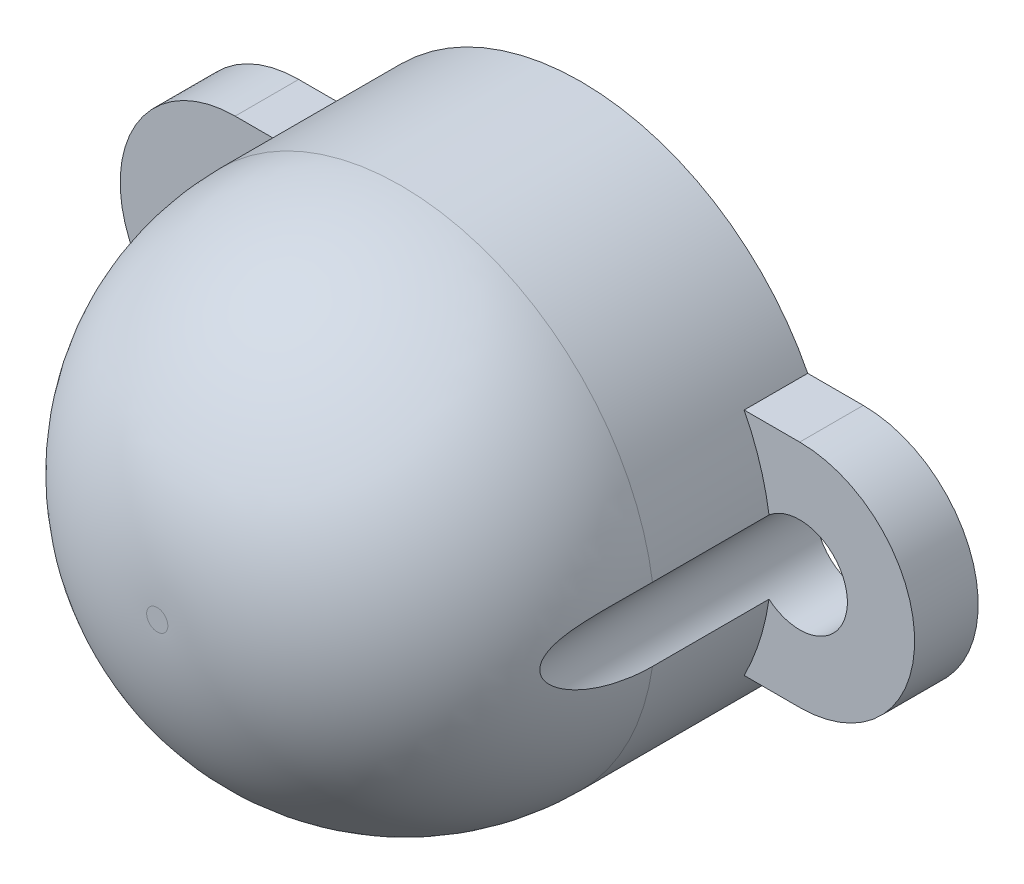
ISO-10303-21;
HEADER;
FILE_DESCRIPTION(('STEP AP214'),'2;1');
FILE_NAME('part.step','',(''),(''),'','','');
FILE_SCHEMA(('AUTOMOTIVE_DESIGN { 1 0 10303 214 1 1 1 1 }'));
ENDSEC;
DATA;
#1=APPLICATION_CONTEXT('core data for automotive mechanical design processes');
#2=APPLICATION_PROTOCOL_DEFINITION('international standard','automotive_design',2000,#1);
#3=PRODUCT_CONTEXT('',#1,'mechanical');
#4=PRODUCT('Part','Part','',(#3));
#5=PRODUCT_RELATED_PRODUCT_CATEGORY('part','',(#4));
#6=PRODUCT_DEFINITION_FORMATION('','',#4);
#7=PRODUCT_DEFINITION_CONTEXT('part definition',#1,'design');
#8=PRODUCT_DEFINITION('design','',#6,#7);
#9=PRODUCT_DEFINITION_SHAPE('','',#8);
#10=(LENGTH_UNIT() NAMED_UNIT(*) SI_UNIT(.MILLI.,.METRE.));
#11=(NAMED_UNIT(*) PLANE_ANGLE_UNIT() SI_UNIT($,.RADIAN.));
#12=(NAMED_UNIT(*) SI_UNIT($,.STERADIAN.) SOLID_ANGLE_UNIT());
#13=UNCERTAINTY_MEASURE_WITH_UNIT(LENGTH_MEASURE(1.E-05),#10,'distance_accuracy_value','');
#14=(GEOMETRIC_REPRESENTATION_CONTEXT(3) GLOBAL_UNCERTAINTY_ASSIGNED_CONTEXT((#13)) GLOBAL_UNIT_ASSIGNED_CONTEXT((#10,
#11,#12)) REPRESENTATION_CONTEXT('',''));
#15=CARTESIAN_POINT('',(0.,0.,0.));
#16=DIRECTION('',(0.,0.,1.));
#17=DIRECTION('',(1.,0.,0.));
#18=AXIS2_PLACEMENT_3D('',#15,#16,#17);
#19=CARTESIAN_POINT('',(0.,0.,0.));
#20=DIRECTION('',(0.,0.,-1.));
#21=DIRECTION('',(-1.,0.,0.));
#22=AXIS2_PLACEMENT_3D('',#19,#20,#21);
#23=CYLINDRICAL_SURFACE('',#22,6.096);
#24=DIRECTION('',(0.,0.,-1.));
#25=VECTOR('',#24,1.);
#26=CARTESIAN_POINT('',(6.03296463414635,-0.874387627508251,14.3509999999997));
#27=LINE('',#26,#25);
#28=CARTESIAN_POINT('',(6.03296463414634,-0.874387627508249,4.318));
#29=VERTEX_POINT('',#28);
#30=CARTESIAN_POINT('',(6.03296463414634,-0.874387627508254,1.524));
#31=VERTEX_POINT('',#30);
#32=EDGE_CURVE('E53',#29,#31,#27,.T.);
#33=ORIENTED_EDGE('',*,*,#32,.F.);
#34=CARTESIAN_POINT('',(0.,0.,4.318));
#35=DIRECTION('',(0.,0.,-1.));
#36=DIRECTION('',(-1.,0.,0.));
#37=AXIS2_PLACEMENT_3D('',#34,#35,#36);
#38=CIRCLE('',#37,6.096);
#39=CARTESIAN_POINT('',(-6.03296463414634,-0.87438762750825,4.318));
#40=VERTEX_POINT('',#39);
#41=EDGE_CURVE('E60',#29,#40,#38,.T.);
#42=ORIENTED_EDGE('',*,*,#41,.T.);
#43=DIRECTION('',(0.,0.,-1.));
#44=VECTOR('',#43,1.);
#45=CARTESIAN_POINT('',(-6.03296463414634,-0.874387627508248,14.3509999999997));
#46=LINE('',#45,#44);
#47=CARTESIAN_POINT('',(-6.03296463414634,-0.874387627508248,1.524));
#48=VERTEX_POINT('',#47);
#49=EDGE_CURVE('E272',#48,#40,#46,.F.);
#50=ORIENTED_EDGE('',*,*,#49,.F.);
#51=CARTESIAN_POINT('',(0.,0.,1.524));
#52=DIRECTION('',(0.,0.,1.));
#53=DIRECTION('',(1.,0.,0.));
#54=AXIS2_PLACEMENT_3D('',#51,#52,#53);
#55=CIRCLE('',#54,6.096);
#56=CARTESIAN_POINT('',(-5.43748390250491,-2.7559,1.524));
#57=VERTEX_POINT('',#56);
#58=EDGE_CURVE('E150',#57,#48,#55,.F.);
#59=ORIENTED_EDGE('',*,*,#58,.F.);
#60=DIRECTION('',(0.,0.,-1.));
#61=VECTOR('',#60,1.);
#62=CARTESIAN_POINT('',(-5.43748390250491,-2.7559,0.));
#63=LINE('',#62,#61);
#64=CARTESIAN_POINT('',(-5.43748390250491,-2.7559,0.));
#65=VERTEX_POINT('',#64);
#66=EDGE_CURVE('E158',#57,#65,#63,.T.);
#67=ORIENTED_EDGE('',*,*,#66,.T.);
#68=CARTESIAN_POINT('',(0.,0.,0.));
#69=DIRECTION('',(0.,0.,-1.));
#70=DIRECTION('',(-1.,0.,0.));
#71=AXIS2_PLACEMENT_3D('',#68,#69,#70);
#72=CIRCLE('',#71,6.096);
#73=CARTESIAN_POINT('',(5.43748390250491,-2.7559,0.));
#74=VERTEX_POINT('',#73);
#75=EDGE_CURVE('E216',#74,#65,#72,.T.);
#76=ORIENTED_EDGE('',*,*,#75,.F.);
#77=DIRECTION('',(0.,0.,-1.));
#78=VECTOR('',#77,1.);
#79=CARTESIAN_POINT('',(5.43748390250491,-2.7559,0.));
#80=LINE('',#79,#78);
#81=CARTESIAN_POINT('',(5.43748390250491,-2.7559,1.524));
#82=VERTEX_POINT('',#81);
#83=EDGE_CURVE('E147',#74,#82,#80,.F.);
#84=ORIENTED_EDGE('',*,*,#83,.T.);
#85=EDGE_CURVE('E148',#31,#82,#55,.F.);
#86=ORIENTED_EDGE('',*,*,#85,.F.);
#87=EDGE_LOOP('',(#33,#42,#50,#59,#67,#76,#84,#86));
#88=FACE_BOUND('',#87,.T.);
#89=ADVANCED_FACE('F33',(#88),#23,.T.);
#90=DIRECTION('',(0.,0.,-1.));
#91=VECTOR('',#90,1.);
#92=CARTESIAN_POINT('',(6.03296463414635,0.874387627508251,14.3509999999997));
#93=LINE('',#92,#91);
#94=CARTESIAN_POINT('',(6.03296463414634,0.874387627508254,1.524));
#95=VERTEX_POINT('',#94);
#96=CARTESIAN_POINT('',(6.03296463414634,0.874387627508251,4.318));
#97=VERTEX_POINT('',#96);
#98=EDGE_CURVE('E127',#95,#97,#93,.F.);
#99=ORIENTED_EDGE('',*,*,#98,.F.);
#100=CARTESIAN_POINT('',(5.43748390250491,2.75590000000001,1.524));
#101=VERTEX_POINT('',#100);
#102=EDGE_CURVE('E137',#101,#95,#55,.F.);
#103=ORIENTED_EDGE('',*,*,#102,.F.);
#104=DIRECTION('',(0.,0.,-1.));
#105=VECTOR('',#104,1.);
#106=CARTESIAN_POINT('',(5.43748390250491,2.7559,0.));
#107=LINE('',#106,#105);
#108=CARTESIAN_POINT('',(5.4374839025049,2.7559,0.));
#109=VERTEX_POINT('',#108);
#110=EDGE_CURVE('E152',#101,#109,#107,.T.);
#111=ORIENTED_EDGE('',*,*,#110,.T.);
#112=CARTESIAN_POINT('',(-5.43748390250491,2.7559,0.));
#113=VERTEX_POINT('',#112);
#114=EDGE_CURVE('E213',#113,#109,#72,.T.);
#115=ORIENTED_EDGE('',*,*,#114,.F.);
#116=DIRECTION('',(0.,0.,-1.));
#117=VECTOR('',#116,1.);
#118=CARTESIAN_POINT('',(-5.43748390250491,2.7559,0.));
#119=LINE('',#118,#117);
#120=CARTESIAN_POINT('',(-5.43748390250491,2.7559,1.524));
#121=VERTEX_POINT('',#120);
#122=EDGE_CURVE('E162',#113,#121,#119,.F.);
#123=ORIENTED_EDGE('',*,*,#122,.T.);
#124=CARTESIAN_POINT('',(-6.03296463414634,0.874387627508241,1.524));
#125=VERTEX_POINT('',#124);
#126=EDGE_CURVE('E155',#125,#121,#55,.F.);
#127=ORIENTED_EDGE('',*,*,#126,.F.);
#128=DIRECTION('',(0.,0.,-1.));
#129=VECTOR('',#128,1.);
#130=CARTESIAN_POINT('',(-6.03296463414634,0.874387627508241,14.3509999999997));
#131=LINE('',#130,#129);
#132=CARTESIAN_POINT('',(-6.03296463414634,0.874387627508242,4.318));
#133=VERTEX_POINT('',#132);
#134=EDGE_CURVE('E273',#133,#125,#131,.T.);
#135=ORIENTED_EDGE('',*,*,#134,.F.);
#136=EDGE_CURVE('E141',#133,#97,#38,.T.);
#137=ORIENTED_EDGE('',*,*,#136,.T.);
#138=EDGE_LOOP('',(#99,#103,#111,#115,#123,#127,#135,#137));
#139=FACE_BOUND('',#138,.T.);
#140=ADVANCED_FACE('F136',(#139),#23,.T.);
#141=CARTESIAN_POINT('',(0.,0.,4.318));
#142=DIRECTION('',(0.,0.,-1.));
#143=DIRECTION('',(-1.,0.,0.));
#144=AXIS2_PLACEMENT_3D('',#141,#142,#143);
#145=DEGENERATE_TOROIDAL_SURFACE('',#144,0.254,5.842,.T.);
#146=CARTESIAN_POINT('',(0.,0.,10.16));
#147=DIRECTION('',(0.,0.,-1.));
#148=DIRECTION('',(-1.,0.,0.));
#149=AXIS2_PLACEMENT_3D('',#146,#147,#148);
#150=CIRCLE('',#149,0.253999999999999);
#151=CARTESIAN_POINT('',(-0.253999999999998,0.,10.16));
#152=VERTEX_POINT('',#151);
#153=EDGE_CURVE('E154',#152,#152,#150,.T.);
#154=ORIENTED_EDGE('',*,*,#153,.T.);
#155=EDGE_LOOP('',(#154));
#156=FACE_BOUND('',#155,.T.);
#157=CARTESIAN_POINT('',(6.03296463106328,0.874387624912658,4.3178));
#158=CARTESIAN_POINT('',(6.03296837216191,0.874380435919147,4.37998224421769));
#159=CARTESIAN_POINT('',(6.03207444354885,0.873637760840966,4.44216570493411));
#160=CARTESIAN_POINT('',(6.02850392735342,0.870618621336915,4.56645311565391));
#161=CARTESIAN_POINT('',(6.02582707692893,0.868341930762659,4.62855705258099));
#162=CARTESIAN_POINT('',(6.01868211477991,0.862173528752198,4.75295574105517));
#163=CARTESIAN_POINT('',(6.01420339222608,0.858272245589021,4.81524941443922));
#164=CARTESIAN_POINT('',(6.00348253419301,0.84872305397544,4.93954841719499));
#165=CARTESIAN_POINT('',(5.99724048612146,0.843075232099284,5.00155376070435));
#166=CARTESIAN_POINT('',(5.98266739837568,0.829504201001664,5.12834329722337));
#167=CARTESIAN_POINT('',(5.97424537524633,0.821478840464267,5.1931062573613));
#168=CARTESIAN_POINT('',(5.95556440959706,0.802983198585516,5.32201426607228));
#169=CARTESIAN_POINT('',(5.94530561745071,0.792513117368513,5.38615936477605));
#170=CARTESIAN_POINT('',(5.92307721212074,0.768738501558357,5.51345190625888));
#171=CARTESIAN_POINT('',(5.91111208031224,0.755441348189046,5.57660149570115));
#172=CARTESIAN_POINT('',(5.88559571884629,0.725437078817424,5.7017457698806));
#173=CARTESIAN_POINT('',(5.87204524768964,0.708731590699608,5.76374099059742));
#174=CARTESIAN_POINT('',(5.84808124303282,0.677075759324679,5.86675305035557));
#175=CARTESIAN_POINT('',(5.83803256587118,0.663243851164864,5.90819828579492));
#176=CARTESIAN_POINT('',(5.81739308256283,0.633273309549118,5.99013825179734));
#177=CARTESIAN_POINT('',(5.80680206529624,0.617133773340088,6.03063260311885));
#178=CARTESIAN_POINT('',(5.78533289935872,0.582293969766678,6.10994414726717));
#179=CARTESIAN_POINT('',(5.7744585036102,0.563619892114143,6.14877374615843));
#180=CARTESIAN_POINT('',(5.75254779730415,0.523070454846571,6.22465688337466));
#181=CARTESIAN_POINT('',(5.74151165886098,0.501198303285407,6.26171215268822));
#182=CARTESIAN_POINT('',(5.72176288666477,0.458232424940561,6.3262626374574));
#183=CARTESIAN_POINT('',(5.71301998997771,0.43783095220955,6.35420517985151));
#184=CARTESIAN_POINT('',(5.69589968124841,0.394011151109271,6.40788435576972));
#185=CARTESIAN_POINT('',(5.68752304194375,0.370586820840717,6.43361642637586));
#186=CARTESIAN_POINT('',(5.67147624856919,0.31997846704881,6.48211460242453));
#187=CARTESIAN_POINT('',(5.66381604284762,0.292751773596437,6.5048403678889));
#188=CARTESIAN_POINT('',(5.65000919017813,0.234460671054601,6.54528669084646));
#189=CARTESIAN_POINT('',(5.6438570292343,0.20341088609108,6.56302551856959));
#190=CARTESIAN_POINT('',(5.63576863860538,0.149837948127659,6.58617019575247));
#191=CARTESIAN_POINT('',(5.63311344027196,0.12835054183306,6.59371382123108));
#192=CARTESIAN_POINT('',(5.62900336022539,0.084349418726054,6.60535829023578));
#193=CARTESIAN_POINT('',(5.62754723079396,0.0618367945440633,6.60946271258084));
#194=CARTESIAN_POINT('',(5.62598810376066,0.0162872871843865,6.61385660523857));
#195=CARTESIAN_POINT('',(5.62589105883902,-0.00675145988425101,6.61412929288065));
#196=CARTESIAN_POINT('',(5.62707723363404,-0.0525110360393418,6.61078767384327));
#197=CARTESIAN_POINT('',(5.62836098825818,-0.0752317384633471,6.60717186079891));
#198=CARTESIAN_POINT('',(5.63206856299959,-0.118569454671015,6.59667789551057));
#199=CARTESIAN_POINT('',(5.63443180123778,-0.139234800208601,6.58997295460578));
#200=CARTESIAN_POINT('',(5.64007460506249,-0.17933593661857,6.5738610012785));
#201=CARTESIAN_POINT('',(5.64335453473445,-0.198771235179696,6.56445291519699));
#202=CARTESIAN_POINT('',(5.65292852610616,-0.248165432289635,6.5367698777183));
#203=CARTESIAN_POINT('',(5.6598145660742,-0.276976837201856,6.51665655965245));
#204=CARTESIAN_POINT('',(5.6747122175952,-0.330987281255641,6.4724007025131));
#205=CARTESIAN_POINT('',(5.6827272195757,-0.356174959508794,6.44824598393526));
#206=CARTESIAN_POINT('',(5.70566128285778,-0.421308871205187,6.37776253064652));
#207=CARTESIAN_POINT('',(5.72119051688193,-0.457890033172531,6.32855382780868));
#208=CARTESIAN_POINT('',(5.75240369615873,-0.523536935593062,6.2254774696512));
#209=CARTESIAN_POINT('',(5.76808794158843,-0.552582583351483,6.17159785935926));
#210=CARTESIAN_POINT('',(5.79964647979027,-0.60632369491152,6.05799524624844));
#211=CARTESIAN_POINT('',(5.8154854315884,-0.630700207878002,5.99811381572968));
#212=CARTESIAN_POINT('',(5.84595777735227,-0.674512395891833,5.87624404720599));
#213=CARTESIAN_POINT('',(5.86058985322249,-0.6939427159937,5.81425350738574));
#214=CARTESIAN_POINT('',(5.88838914167774,-0.728900983187193,5.68862261906034));
#215=CARTESIAN_POINT('',(5.90155085471568,-0.744414536203264,5.62497710677642));
#216=CARTESIAN_POINT('',(5.92616169562464,-0.772170010164033,5.49664525947615));
#217=CARTESIAN_POINT('',(5.93761037884822,-0.78441108232435,5.43195865903597));
#218=CARTESIAN_POINT('',(5.96213612047972,-0.809732097851853,5.280375700235));
#219=CARTESIAN_POINT('',(5.97450547373515,-0.821757883513001,5.19318864567175));
#220=CARTESIAN_POINT('',(5.99579395733323,-0.841817724273174,5.0179144518733));
#221=CARTESIAN_POINT('',(6.0047116001504,-0.849850058805072,4.92982694133098));
#222=CARTESIAN_POINT('',(6.01886151202707,-0.862371089480565,4.75449375305616));
#223=CARTESIAN_POINT('',(6.0241488502953,-0.866912867667299,4.66725623897278));
#224=CARTESIAN_POINT('',(6.0312039109636,-0.872903243802581,4.49260987324151));
#225=CARTESIAN_POINT('',(6.03297476928987,-0.874354597812971,4.40520124389772));
#226=CARTESIAN_POINT('',(6.03296463106328,-0.874387624912657,4.3178));
#227=B_SPLINE_CURVE_WITH_KNOTS('',3,(#157,#158,#159,#160,#161,#162,#163,#164,#165,#166,#167,
#168,#169,#170,#171,#172,#173,#174,#175,#176,#177,#178,#179,#180,#181,#182,#183,#184,#185,#186,
#187,#188,#189,#190,#191,#192,#193,#194,#195,#196,#197,#198,#199,#200,#201,#202,#203,#204,#205,
#206,#207,#208,#209,#210,#211,#212,#213,#214,#215,#216,#217,#218,#219,#220,#221,#222,#223,#224,
#225,#226),.UNSPECIFIED.,.F.,.F.,(4,2,2,2,2,2,2,2,2,2,2,2,2,2,2,2,2,2,2,2,2,2,2,2,2,2,2,2,2,2,2,
2,2,2,4),(0.,0.18653769876623,0.373102903403305,0.560783217783316,0.74845423052096,
0.94578457258841,1.14309876689274,1.33990398340465,1.53661542118723,1.67105626781806,
1.80554985286929,1.93874671263599,2.07181086506004,2.17871631344658,2.28583738649962,
2.39427502483801,2.50231005219474,2.57082565237287,2.63926986667725,2.70801376781575,
2.77678430922601,2.8420963117263,2.90743429136931,3.01423040257081,3.12135436038462,
3.31004333357153,3.49923037284812,3.69861692532372,3.89821843226135,4.09854313165751,
4.29891973903408,4.5653633787612,4.83192171570954,5.09434148722634,5.35652713277504),.UNSPECIFIED.);
#228=EDGE_CURVE('E252',#97,#29,#227,.T.);
#229=ORIENTED_EDGE('',*,*,#228,.F.);
#230=ORIENTED_EDGE('',*,*,#136,.F.);
#231=CARTESIAN_POINT('',(-6.03296463106328,-0.874387624912659,4.3178));
#232=CARTESIAN_POINT('',(-6.03296837216191,-0.874380435919148,4.37998224421769));
#233=CARTESIAN_POINT('',(-6.03207444354885,-0.873637760840967,4.44216570493411));
#234=CARTESIAN_POINT('',(-6.02850392735342,-0.870618621336916,4.5664531156539));
#235=CARTESIAN_POINT('',(-6.02582707692893,-0.868341930762661,4.62855705258099));
#236=CARTESIAN_POINT('',(-6.01868211477991,-0.8621735287522,4.75295574105517));
#237=CARTESIAN_POINT('',(-6.01420339222608,-0.858272245589023,4.81524941443921));
#238=CARTESIAN_POINT('',(-6.00348253419301,-0.848723053975441,4.93954841719499));
#239=CARTESIAN_POINT('',(-5.99724048612146,-0.843075232099284,5.00155376070435));
#240=CARTESIAN_POINT('',(-5.98266739837568,-0.829504201001665,5.12834329722337));
#241=CARTESIAN_POINT('',(-5.97424537524633,-0.82147884046427,5.1931062573613));
#242=CARTESIAN_POINT('',(-5.95556440959706,-0.802983198585519,5.32201426607227));
#243=CARTESIAN_POINT('',(-5.94530561745071,-0.792513117368515,5.38615936477604));
#244=CARTESIAN_POINT('',(-5.92307721212073,-0.768738501558358,5.51345190625888));
#245=CARTESIAN_POINT('',(-5.91111208031224,-0.755441348189047,5.57660149570115));
#246=CARTESIAN_POINT('',(-5.88559571884629,-0.725437078817425,5.70174576988059));
#247=CARTESIAN_POINT('',(-5.87204524768964,-0.708731590699609,5.76374099059742));
#248=CARTESIAN_POINT('',(-5.84808124303282,-0.677075759324681,5.86675305035556));
#249=CARTESIAN_POINT('',(-5.83803256587118,-0.663243851164867,5.90819828579492));
#250=CARTESIAN_POINT('',(-5.81739308256283,-0.63327330954912,5.99013825179733));
#251=CARTESIAN_POINT('',(-5.80680206529624,-0.617133773340089,6.03063260311885));
#252=CARTESIAN_POINT('',(-5.78533289935872,-0.582293969766679,6.10994414726717));
#253=CARTESIAN_POINT('',(-5.7744585036102,-0.563619892114145,6.14877374615843));
#254=CARTESIAN_POINT('',(-5.75254779730415,-0.523070454846573,6.22465688337465));
#255=CARTESIAN_POINT('',(-5.74151165886098,-0.501198303285408,6.26171215268821));
#256=CARTESIAN_POINT('',(-5.72176288666477,-0.458232424940563,6.32626263745739));
#257=CARTESIAN_POINT('',(-5.71301998997771,-0.437830952209553,6.35420517985151));
#258=CARTESIAN_POINT('',(-5.69589968124841,-0.394011151109274,6.40788435576972));
#259=CARTESIAN_POINT('',(-5.68752304194375,-0.370586820840718,6.43361642637586));
#260=CARTESIAN_POINT('',(-5.67147624856919,-0.319978467048811,6.48211460242452));
#261=CARTESIAN_POINT('',(-5.66381604284762,-0.292751773596438,6.5048403678889));
#262=CARTESIAN_POINT('',(-5.65000919017813,-0.234460671054602,6.54528669084645));
#263=CARTESIAN_POINT('',(-5.6438570292343,-0.20341088609108,6.56302551856958));
#264=CARTESIAN_POINT('',(-5.63576863860538,-0.149837948127659,6.58617019575247));
#265=CARTESIAN_POINT('',(-5.63311344027196,-0.12835054183306,6.59371382123108));
#266=CARTESIAN_POINT('',(-5.62900336022539,-0.0843494187260545,6.60535829023578));
#267=CARTESIAN_POINT('',(-5.62754723079396,-0.0618367945440635,6.60946271258084));
#268=CARTESIAN_POINT('',(-5.62598810376066,-0.0162872871843863,6.61385660523857));
#269=CARTESIAN_POINT('',(-5.62589105883902,0.00675145988425139,6.61412929288065));
#270=CARTESIAN_POINT('',(-5.62707723363404,0.0525110360393418,6.61078767384327));
#271=CARTESIAN_POINT('',(-5.62836098825818,0.0752317384633466,6.6071718607989));
#272=CARTESIAN_POINT('',(-5.63206856299959,0.118569454671015,6.59667789551056));
#273=CARTESIAN_POINT('',(-5.63443180123778,0.139234800208602,6.58997295460577));
#274=CARTESIAN_POINT('',(-5.6400746050625,0.179335936618571,6.5738610012785));
#275=CARTESIAN_POINT('',(-5.64335453473446,0.198771235179696,6.56445291519698));
#276=CARTESIAN_POINT('',(-5.65292852610617,0.248165432289634,6.53676987771829));
#277=CARTESIAN_POINT('',(-5.6598145660742,0.276976837201856,6.51665655965244));
#278=CARTESIAN_POINT('',(-5.6747122175952,0.330987281255641,6.47240070251309));
#279=CARTESIAN_POINT('',(-5.68272721957571,0.356174959508795,6.44824598393525));
#280=CARTESIAN_POINT('',(-5.70566128285778,0.421308871205189,6.37776253064651));
#281=CARTESIAN_POINT('',(-5.72119051688193,0.457890033172532,6.32855382780867));
#282=CARTESIAN_POINT('',(-5.75240369615874,0.523536935593063,6.22547746965119));
#283=CARTESIAN_POINT('',(-5.76808794158844,0.552582583351484,6.17159785935924));
#284=CARTESIAN_POINT('',(-5.79964647979027,0.606323694911521,6.05799524624842));
#285=CARTESIAN_POINT('',(-5.8154854315884,0.630700207878002,5.99811381572966));
#286=CARTESIAN_POINT('',(-5.84595777735227,0.674512395891834,5.87624404720597));
#287=CARTESIAN_POINT('',(-5.86058985322249,0.6939427159937,5.81425350738571));
#288=CARTESIAN_POINT('',(-5.88838914167774,0.728900983187194,5.68862261906031));
#289=CARTESIAN_POINT('',(-5.90155085471568,0.744414536203264,5.62497710677639));
#290=CARTESIAN_POINT('',(-5.92616169562465,0.772170010164033,5.49664525947612));
#291=CARTESIAN_POINT('',(-5.93761037884823,0.78441108232435,5.43195865903594));
#292=CARTESIAN_POINT('',(-5.96213612047973,0.809732097851851,5.28037570023497));
#293=CARTESIAN_POINT('',(-5.97450547373515,0.821757883512998,5.19318864567172));
#294=CARTESIAN_POINT('',(-5.99579395733324,0.841817724273169,5.01791445187327));
#295=CARTESIAN_POINT('',(-6.0047116001504,0.849850058805067,4.92982694133097));
#296=CARTESIAN_POINT('',(-6.01886151202707,0.86237108948056,4.75449375305615));
#297=CARTESIAN_POINT('',(-6.0241488502953,0.866912867667294,4.66725623897277));
#298=CARTESIAN_POINT('',(-6.0312039109636,0.872903243802577,4.49260987324151));
#299=CARTESIAN_POINT('',(-6.03297476928987,0.874354597812966,4.40520124389771));
#300=CARTESIAN_POINT('',(-6.03296463106328,0.874387624912651,4.3178));
#301=B_SPLINE_CURVE_WITH_KNOTS('',3,(#231,#232,#233,#234,#235,#236,#237,#238,#239,#240,#241,
#242,#243,#244,#245,#246,#247,#248,#249,#250,#251,#252,#253,#254,#255,#256,#257,#258,#259,#260,
#261,#262,#263,#264,#265,#266,#267,#268,#269,#270,#271,#272,#273,#274,#275,#276,#277,#278,#279,
#280,#281,#282,#283,#284,#285,#286,#287,#288,#289,#290,#291,#292,#293,#294,#295,#296,#297,#298,
#299,#300),.UNSPECIFIED.,.F.,.F.,(4,2,2,2,2,2,2,2,2,2,2,2,2,2,2,2,2,2,2,2,2,2,2,2,2,2,2,2,2,2,2,
2,2,2,4),(0.,0.18653769876623,0.373102903403304,0.560783217783314,0.748454230520957,
0.945784572588406,1.14309876689274,1.33990398340465,1.53661542118723,1.67105626781806,
1.80554985286929,1.93874671263598,2.07181086506004,2.17871631344658,2.28583738649961,
2.39427502483801,2.50231005219474,2.57082565237287,2.63926986667725,2.70801376781575,
2.776784309226,2.84209631172629,2.90743429136931,3.01423040257081,3.12135436038462,
3.31004333357153,3.49923037284813,3.69861692532373,3.89821843226136,4.09854313165753,
4.29891973903411,4.56536337876122,4.83192171570955,5.09434148722634,5.35652713277503),.UNSPECIFIED.);
#302=EDGE_CURVE('E11',#40,#133,#301,.T.);
#303=ORIENTED_EDGE('',*,*,#302,.F.);
#304=ORIENTED_EDGE('',*,*,#41,.F.);
#305=EDGE_LOOP('',(#229,#230,#303,#304));
#306=FACE_BOUND('',#305,.T.);
#307=ADVANCED_FACE('F225',(#156,#306),#145,.T.);
#308=CARTESIAN_POINT('',(6.7691,2.75590000000001,1.524));
#309=DIRECTION('',(0.,-1.,0.));
#310=DIRECTION('',(1.,0.,0.));
#311=AXIS2_PLACEMENT_3D('',#308,#309,#310);
#312=PLANE('',#311);
#313=ORIENTED_EDGE('',*,*,#122,.F.);
#314=DIRECTION('',(-1.,0.,0.));
#315=VECTOR('',#314,1.);
#316=CARTESIAN_POINT('',(6.7691,2.75590000000001,0.));
#317=LINE('',#316,#315);
#318=CARTESIAN_POINT('',(-6.7691,2.7559,0.));
#319=VERTEX_POINT('',#318);
#320=EDGE_CURVE('E184',#113,#319,#317,.T.);
#321=ORIENTED_EDGE('',*,*,#320,.T.);
#322=DIRECTION('',(0.,0.,-1.));
#323=VECTOR('',#322,1.);
#324=CARTESIAN_POINT('',(-6.7691,2.7559,1.524));
#325=LINE('',#324,#323);
#326=CARTESIAN_POINT('',(-6.7691,2.7559,1.524));
#327=VERTEX_POINT('',#326);
#328=EDGE_CURVE('E198',#327,#319,#325,.T.);
#329=ORIENTED_EDGE('',*,*,#328,.F.);
#330=DIRECTION('',(-1.,0.,0.));
#331=VECTOR('',#330,1.);
#332=CARTESIAN_POINT('',(6.7691,2.75590000000001,1.524));
#333=LINE('',#332,#331);
#334=EDGE_CURVE('E173',#121,#327,#333,.T.);
#335=ORIENTED_EDGE('',*,*,#334,.F.);
#336=EDGE_LOOP('',(#313,#321,#329,#335));
#337=FACE_BOUND('',#336,.T.);
#338=ADVANCED_FACE('F249',(#337),#312,.F.);
#339=ORIENTED_EDGE('',*,*,#110,.F.);
#340=CARTESIAN_POINT('',(6.7691,2.75590000000001,1.524));
#341=VERTEX_POINT('',#340);
#342=EDGE_CURVE('E146',#341,#101,#333,.T.);
#343=ORIENTED_EDGE('',*,*,#342,.F.);
#344=DIRECTION('',(0.,0.,-1.));
#345=VECTOR('',#344,1.);
#346=CARTESIAN_POINT('',(6.7691,2.75590000000001,1.524));
#347=LINE('',#346,#345);
#348=CARTESIAN_POINT('',(6.7691,2.75590000000001,0.));
#349=VERTEX_POINT('',#348);
#350=EDGE_CURVE('E46',#341,#349,#347,.T.);
#351=ORIENTED_EDGE('',*,*,#350,.T.);
#352=EDGE_CURVE('E185',#349,#109,#317,.T.);
#353=ORIENTED_EDGE('',*,*,#352,.T.);
#354=EDGE_LOOP('',(#339,#343,#351,#353));
#355=FACE_BOUND('',#354,.T.);
#356=ADVANCED_FACE('F203',(#355),#312,.F.);
#357=CARTESIAN_POINT('',(6.7691,-2.7559,1.524));
#358=DIRECTION('',(0.,1.,0.));
#359=DIRECTION('',(-1.,0.,0.));
#360=AXIS2_PLACEMENT_3D('',#357,#358,#359);
#361=PLANE('',#360);
#362=ORIENTED_EDGE('',*,*,#83,.F.);
#363=DIRECTION('',(1.,0.,0.));
#364=VECTOR('',#363,1.);
#365=CARTESIAN_POINT('',(6.7691,-2.7559,0.));
#366=LINE('',#365,#364);
#367=CARTESIAN_POINT('',(6.7691,-2.7559,0.));
#368=VERTEX_POINT('',#367);
#369=EDGE_CURVE('E190',#74,#368,#366,.T.);
#370=ORIENTED_EDGE('',*,*,#369,.T.);
#371=DIRECTION('',(0.,0.,-1.));
#372=VECTOR('',#371,1.);
#373=CARTESIAN_POINT('',(6.7691,-2.7559,1.524));
#374=LINE('',#373,#372);
#375=CARTESIAN_POINT('',(6.7691,-2.7559,1.524));
#376=VERTEX_POINT('',#375);
#377=EDGE_CURVE('E181',#376,#368,#374,.T.);
#378=ORIENTED_EDGE('',*,*,#377,.F.);
#379=DIRECTION('',(1.,0.,0.));
#380=VECTOR('',#379,1.);
#381=CARTESIAN_POINT('',(6.7691,-2.7559,1.524));
#382=LINE('',#381,#380);
#383=EDGE_CURVE('E178',#82,#376,#382,.T.);
#384=ORIENTED_EDGE('',*,*,#383,.F.);
#385=EDGE_LOOP('',(#362,#370,#378,#384));
#386=FACE_BOUND('',#385,.T.);
#387=ADVANCED_FACE('F291',(#386),#361,.F.);
#388=ORIENTED_EDGE('',*,*,#66,.F.);
#389=CARTESIAN_POINT('',(-6.7691,-2.7559,1.524));
#390=VERTEX_POINT('',#389);
#391=EDGE_CURVE('E179',#390,#57,#382,.T.);
#392=ORIENTED_EDGE('',*,*,#391,.F.);
#393=DIRECTION('',(0.,0.,-1.));
#394=VECTOR('',#393,1.);
#395=CARTESIAN_POINT('',(-6.7691,-2.7559,1.524));
#396=LINE('',#395,#394);
#397=CARTESIAN_POINT('',(-6.7691,-2.7559,0.));
#398=VERTEX_POINT('',#397);
#399=EDGE_CURVE('E195',#390,#398,#396,.T.);
#400=ORIENTED_EDGE('',*,*,#399,.T.);
#401=EDGE_CURVE('E174',#398,#65,#366,.T.);
#402=ORIENTED_EDGE('',*,*,#401,.T.);
#403=EDGE_LOOP('',(#388,#392,#400,#402));
#404=FACE_BOUND('',#403,.T.);
#405=ADVANCED_FACE('F287',(#404),#361,.F.);
#406=CARTESIAN_POINT('',(6.7691,0.,1.524));
#407=DIRECTION('',(0.,0.,1.));
#408=DIRECTION('',(1.,0.,0.));
#409=AXIS2_PLACEMENT_3D('',#406,#407,#408);
#410=PLANE('',#409);
#411=ORIENTED_EDGE('',*,*,#58,.T.);
#412=CARTESIAN_POINT('',(-6.7691,0.,1.524));
#413=DIRECTION('',(0.,0.,1.));
#414=DIRECTION('',(1.,0.,0.));
#415=AXIS2_PLACEMENT_3D('',#412,#413,#414);
#416=CIRCLE('',#415,1.143);
#417=EDGE_CURVE('E219',#48,#125,#416,.F.);
#418=ORIENTED_EDGE('',*,*,#417,.T.);
#419=ORIENTED_EDGE('',*,*,#126,.T.);
#420=ORIENTED_EDGE('',*,*,#334,.T.);
#421=CARTESIAN_POINT('',(-6.7691,0.,1.524));
#422=DIRECTION('',(0.,0.,1.));
#423=DIRECTION('',(1.,0.,0.));
#424=AXIS2_PLACEMENT_3D('',#421,#422,#423);
#425=CIRCLE('',#424,2.7559);
#426=EDGE_CURVE('E176',#327,#390,#425,.T.);
#427=ORIENTED_EDGE('',*,*,#426,.T.);
#428=ORIENTED_EDGE('',*,*,#391,.T.);
#429=EDGE_LOOP('',(#411,#418,#419,#420,#427,#428));
#430=FACE_BOUND('',#429,.T.);
#431=ADVANCED_FACE('F275',(#430),#410,.T.);
#432=CARTESIAN_POINT('',(6.7691,0.,1.524));
#433=DIRECTION('',(0.,0.,-1.));
#434=DIRECTION('',(-1.,0.,0.));
#435=AXIS2_PLACEMENT_3D('',#432,#433,#434);
#436=CYLINDRICAL_SURFACE('',#435,2.7559);
#437=CARTESIAN_POINT('',(6.7691,0.,0.));
#438=DIRECTION('',(0.,0.,1.));
#439=DIRECTION('',(1.,0.,0.));
#440=AXIS2_PLACEMENT_3D('',#437,#438,#439);
#441=CIRCLE('',#440,2.7559);
#442=EDGE_CURVE('E170',#368,#349,#441,.T.);
#443=ORIENTED_EDGE('',*,*,#442,.T.);
#444=ORIENTED_EDGE('',*,*,#350,.F.);
#445=CARTESIAN_POINT('',(6.7691,0.,1.524));
#446=DIRECTION('',(0.,0.,1.));
#447=DIRECTION('',(1.,0.,0.));
#448=AXIS2_PLACEMENT_3D('',#445,#446,#447);
#449=CIRCLE('',#448,2.7559);
#450=EDGE_CURVE('E171',#376,#341,#449,.T.);
#451=ORIENTED_EDGE('',*,*,#450,.F.);
#452=ORIENTED_EDGE('',*,*,#377,.T.);
#453=EDGE_LOOP('',(#443,#444,#451,#452));
#454=FACE_BOUND('',#453,.T.);
#455=ADVANCED_FACE('F35',(#454),#436,.T.);
#456=CARTESIAN_POINT('',(-6.7691,0.,1.524));
#457=DIRECTION('',(0.,0.,-1.));
#458=DIRECTION('',(-1.,0.,0.));
#459=AXIS2_PLACEMENT_3D('',#456,#457,#458);
#460=CYLINDRICAL_SURFACE('',#459,2.7559);
#461=CARTESIAN_POINT('',(-6.7691,0.,0.));
#462=DIRECTION('',(0.,0.,1.));
#463=DIRECTION('',(1.,0.,0.));
#464=AXIS2_PLACEMENT_3D('',#461,#462,#463);
#465=CIRCLE('',#464,2.7559);
#466=EDGE_CURVE('E188',#319,#398,#465,.T.);
#467=ORIENTED_EDGE('',*,*,#466,.T.);
#468=ORIENTED_EDGE('',*,*,#399,.F.);
#469=ORIENTED_EDGE('',*,*,#426,.F.);
#470=ORIENTED_EDGE('',*,*,#328,.T.);
#471=EDGE_LOOP('',(#467,#468,#469,#470));
#472=FACE_BOUND('',#471,.T.);
#473=ADVANCED_FACE('F283',(#472),#460,.T.);
#474=ORIENTED_EDGE('',*,*,#102,.T.);
#475=CARTESIAN_POINT('',(6.7691,0.,1.524));
#476=DIRECTION('',(0.,0.,1.));
#477=DIRECTION('',(1.,0.,0.));
#478=AXIS2_PLACEMENT_3D('',#475,#476,#477);
#479=CIRCLE('',#478,1.143);
#480=EDGE_CURVE('E124',#95,#31,#479,.F.);
#481=ORIENTED_EDGE('',*,*,#480,.T.);
#482=ORIENTED_EDGE('',*,*,#85,.T.);
#483=ORIENTED_EDGE('',*,*,#383,.T.);
#484=ORIENTED_EDGE('',*,*,#450,.T.);
#485=ORIENTED_EDGE('',*,*,#342,.T.);
#486=EDGE_LOOP('',(#474,#481,#482,#483,#484,#485));
#487=FACE_BOUND('',#486,.T.);
#488=ADVANCED_FACE('F144',(#487),#410,.T.);
#489=CARTESIAN_POINT('',(6.7691,0.,0.));
#490=DIRECTION('',(0.,0.,1.));
#491=DIRECTION('',(1.,0.,0.));
#492=AXIS2_PLACEMENT_3D('',#489,#490,#491);
#493=PLANE('',#492);
#494=CARTESIAN_POINT('',(6.7691,0.,0.));
#495=DIRECTION('',(0.,0.,1.));
#496=DIRECTION('',(1.,0.,0.));
#497=AXIS2_PLACEMENT_3D('',#494,#495,#496);
#498=CIRCLE('',#497,1.143);
#499=CARTESIAN_POINT('',(7.9121,0.,0.));
#500=VERTEX_POINT('',#499);
#501=EDGE_CURVE('E132',#500,#500,#498,.T.);
#502=ORIENTED_EDGE('',*,*,#501,.T.);
#503=EDGE_LOOP('',(#502));
#504=FACE_BOUND('',#503,.T.);
#505=CARTESIAN_POINT('',(-6.7691,0.,0.));
#506=DIRECTION('',(0.,0.,1.));
#507=DIRECTION('',(1.,0.,0.));
#508=AXIS2_PLACEMENT_3D('',#505,#506,#507);
#509=CIRCLE('',#508,1.143);
#510=CARTESIAN_POINT('',(-5.6261,0.,0.));
#511=VERTEX_POINT('',#510);
#512=EDGE_CURVE('E258',#511,#511,#509,.T.);
#513=ORIENTED_EDGE('',*,*,#512,.T.);
#514=EDGE_LOOP('',(#513));
#515=FACE_BOUND('',#514,.T.);
#516=ORIENTED_EDGE('',*,*,#369,.F.);
#517=ORIENTED_EDGE('',*,*,#75,.T.);
#518=ORIENTED_EDGE('',*,*,#401,.F.);
#519=ORIENTED_EDGE('',*,*,#466,.F.);
#520=ORIENTED_EDGE('',*,*,#320,.F.);
#521=ORIENTED_EDGE('',*,*,#114,.T.);
#522=ORIENTED_EDGE('',*,*,#352,.F.);
#523=ORIENTED_EDGE('',*,*,#442,.F.);
#524=EDGE_LOOP('',(#516,#517,#518,#519,#520,#521,#522,#523));
#525=FACE_BOUND('',#524,.T.);
#526=ADVANCED_FACE('F210',(#504,#515,#525),#493,.F.);
#527=CARTESIAN_POINT('',(0.,0.,10.16));
#528=DIRECTION('',(0.,0.,-1.));
#529=DIRECTION('',(-1.,0.,0.));
#530=AXIS2_PLACEMENT_3D('',#527,#528,#529);
#531=PLANE('',#530);
#532=ORIENTED_EDGE('',*,*,#153,.F.);
#533=EDGE_LOOP('',(#532));
#534=FACE_BOUND('',#533,.T.);
#535=ADVANCED_FACE('F228',(#534),#531,.F.);
#536=CARTESIAN_POINT('',(-6.7691,0.,28.7019999999995));
#537=DIRECTION('',(0.,0.,-1.));
#538=DIRECTION('',(-1.,0.,0.));
#539=AXIS2_PLACEMENT_3D('',#536,#537,#538);
#540=CYLINDRICAL_SURFACE('',#539,1.143);
#541=ORIENTED_EDGE('',*,*,#49,.T.);
#542=ORIENTED_EDGE('',*,*,#302,.T.);
#543=ORIENTED_EDGE('',*,*,#134,.T.);
#544=ORIENTED_EDGE('',*,*,#417,.F.);
#545=EDGE_LOOP('',(#541,#542,#543,#544));
#546=FACE_BOUND('',#545,.T.);
#547=ORIENTED_EDGE('',*,*,#512,.F.);
#548=EDGE_LOOP('',(#547));
#549=FACE_BOUND('',#548,.T.);
#550=ADVANCED_FACE('F230',(#546,#549),#540,.F.);
#551=CARTESIAN_POINT('',(6.7691,0.,28.7019999999995));
#552=DIRECTION('',(0.,0.,-1.));
#553=DIRECTION('',(-1.,0.,0.));
#554=AXIS2_PLACEMENT_3D('',#551,#552,#553);
#555=CYLINDRICAL_SURFACE('',#554,1.143);
#556=ORIENTED_EDGE('',*,*,#501,.F.);
#557=EDGE_LOOP('',(#556));
#558=FACE_BOUND('',#557,.T.);
#559=ORIENTED_EDGE('',*,*,#228,.T.);
#560=ORIENTED_EDGE('',*,*,#32,.T.);
#561=ORIENTED_EDGE('',*,*,#480,.F.);
#562=ORIENTED_EDGE('',*,*,#98,.T.);
#563=EDGE_LOOP('',(#559,#560,#561,#562));
#564=FACE_BOUND('',#563,.T.);
#565=ADVANCED_FACE('F126',(#558,#564),#555,.F.);
#566=CLOSED_SHELL('',(#89,#140,#307,#338,#356,#387,#405,#431,#455,#473,#488,#526,#535,#550,#565));
#567=MANIFOLD_SOLID_BREP('B2',#566);
#568=ADVANCED_BREP_SHAPE_REPRESENTATION('',(#18,#567),#14);
#569=SHAPE_DEFINITION_REPRESENTATION(#9,#568);
ENDSEC;
END-ISO-10303-21;
